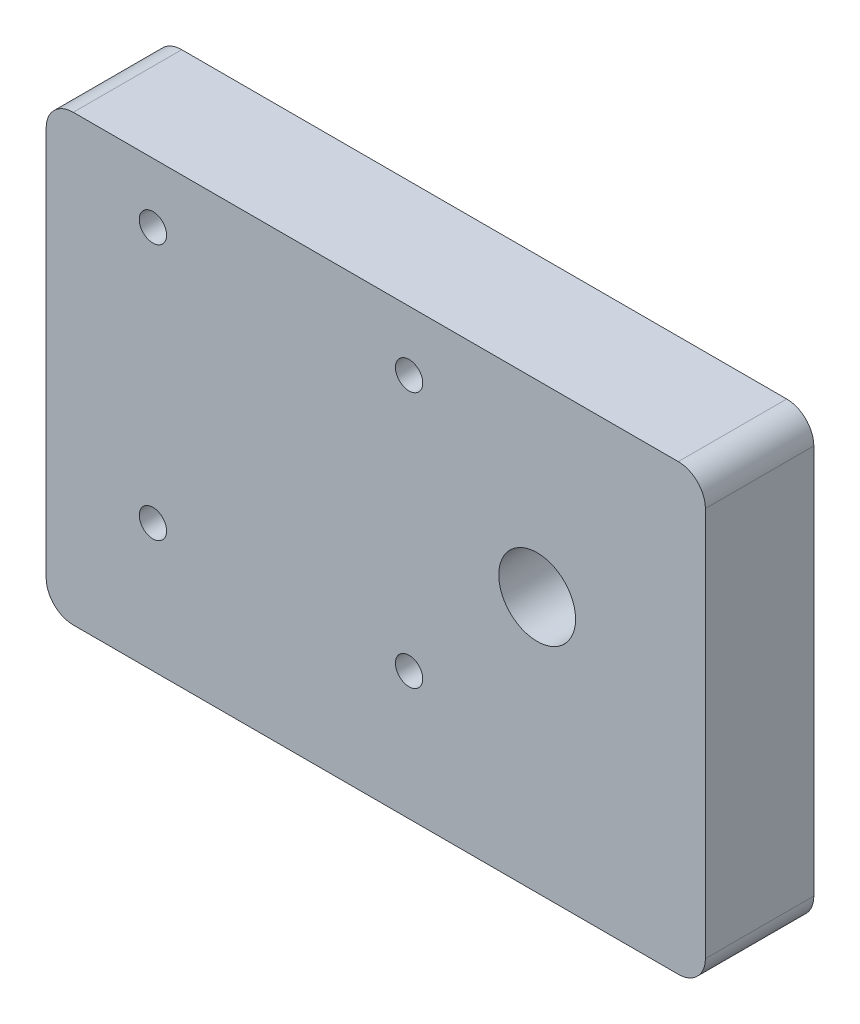
ISO-10303-21;
HEADER;
FILE_DESCRIPTION(('STEP AP214'),'2;1');
FILE_NAME('part.step','',(''),(''),'','','');
FILE_SCHEMA(('AUTOMOTIVE_DESIGN { 1 0 10303 214 1 1 1 1 }'));
ENDSEC;
DATA;
#1=APPLICATION_CONTEXT('core data for automotive mechanical design processes');
#2=APPLICATION_PROTOCOL_DEFINITION('international standard','automotive_design',2000,#1);
#3=PRODUCT_CONTEXT('',#1,'mechanical');
#4=PRODUCT('Part','Part','',(#3));
#5=PRODUCT_RELATED_PRODUCT_CATEGORY('part','',(#4));
#6=PRODUCT_DEFINITION_FORMATION('','',#4);
#7=PRODUCT_DEFINITION_CONTEXT('part definition',#1,'design');
#8=PRODUCT_DEFINITION('design','',#6,#7);
#9=PRODUCT_DEFINITION_SHAPE('','',#8);
#10=(LENGTH_UNIT() NAMED_UNIT(*) SI_UNIT(.MILLI.,.METRE.));
#11=(NAMED_UNIT(*) PLANE_ANGLE_UNIT() SI_UNIT($,.RADIAN.));
#12=(NAMED_UNIT(*) SI_UNIT($,.STERADIAN.) SOLID_ANGLE_UNIT());
#13=UNCERTAINTY_MEASURE_WITH_UNIT(LENGTH_MEASURE(1.E-05),#10,'distance_accuracy_value','');
#14=(GEOMETRIC_REPRESENTATION_CONTEXT(3) GLOBAL_UNCERTAINTY_ASSIGNED_CONTEXT((#13)) GLOBAL_UNIT_ASSIGNED_CONTEXT((#10,
#11,#12)) REPRESENTATION_CONTEXT('',''));
#15=CARTESIAN_POINT('',(0.,0.,0.));
#16=DIRECTION('',(0.,0.,1.));
#17=DIRECTION('',(1.,0.,0.));
#18=AXIS2_PLACEMENT_3D('',#15,#16,#17);
#19=CARTESIAN_POINT('',(72.2,0.,12.7));
#20=DIRECTION('',(1.,0.,0.));
#21=DIRECTION('',(0.,1.,0.));
#22=AXIS2_PLACEMENT_3D('',#19,#20,#21);
#23=PLANE('',#22);
#24=DIRECTION('',(0.,-1.,0.));
#25=VECTOR('',#24,1.);
#26=CARTESIAN_POINT('',(72.2,0.,0.));
#27=LINE('',#26,#25);
#28=CARTESIAN_POINT('',(72.2,-3.175,0.));
#29=VERTEX_POINT('',#28);
#30=CARTESIAN_POINT('',(72.2,-48.825,0.));
#31=VERTEX_POINT('',#30);
#32=EDGE_CURVE('E162',#29,#31,#27,.T.);
#33=ORIENTED_EDGE('',*,*,#32,.F.);
#34=DIRECTION('',(0.,0.,-1.));
#35=VECTOR('',#34,1.);
#36=CARTESIAN_POINT('',(72.2,-3.175,12.7));
#37=LINE('',#36,#35);
#38=CARTESIAN_POINT('',(72.2,-3.175,12.7));
#39=VERTEX_POINT('',#38);
#40=EDGE_CURVE('E178',#29,#39,#37,.F.);
#41=ORIENTED_EDGE('',*,*,#40,.T.);
#42=DIRECTION('',(0.,-1.,0.));
#43=VECTOR('',#42,1.);
#44=CARTESIAN_POINT('',(72.2,0.,12.7));
#45=LINE('',#44,#43);
#46=CARTESIAN_POINT('',(72.2,-48.825,12.7));
#47=VERTEX_POINT('',#46);
#48=EDGE_CURVE('E161',#39,#47,#45,.T.);
#49=ORIENTED_EDGE('',*,*,#48,.T.);
#50=DIRECTION('',(0.,0.,1.));
#51=VECTOR('',#50,1.);
#52=CARTESIAN_POINT('',(72.2,-48.825,0.));
#53=LINE('',#52,#51);
#54=EDGE_CURVE('E176',#47,#31,#53,.F.);
#55=ORIENTED_EDGE('',*,*,#54,.T.);
#56=EDGE_LOOP('',(#33,#41,#49,#55));
#57=FACE_BOUND('',#56,.T.);
#58=ADVANCED_FACE('F73',(#57),#23,.T.);
#59=CARTESIAN_POINT('',(0.,0.,12.7));
#60=DIRECTION('',(0.,1.,0.));
#61=DIRECTION('',(0.,0.,1.));
#62=AXIS2_PLACEMENT_3D('',#59,#60,#61);
#63=PLANE('',#62);
#64=DIRECTION('',(1.,0.,0.));
#65=VECTOR('',#64,1.);
#66=CARTESIAN_POINT('',(0.,0.,12.7));
#67=LINE('',#66,#65);
#68=CARTESIAN_POINT('',(-1.825,0.,12.7));
#69=VERTEX_POINT('',#68);
#70=CARTESIAN_POINT('',(69.025,0.,12.7));
#71=VERTEX_POINT('',#70);
#72=EDGE_CURVE('E166',#69,#71,#67,.T.);
#73=ORIENTED_EDGE('',*,*,#72,.T.);
#74=DIRECTION('',(0.,0.,-1.));
#75=VECTOR('',#74,1.);
#76=CARTESIAN_POINT('',(69.025,0.,12.7));
#77=LINE('',#76,#75);
#78=CARTESIAN_POINT('',(69.025,0.,0.));
#79=VERTEX_POINT('',#78);
#80=EDGE_CURVE('E160',#71,#79,#77,.T.);
#81=ORIENTED_EDGE('',*,*,#80,.T.);
#82=DIRECTION('',(1.,0.,0.));
#83=VECTOR('',#82,1.);
#84=CARTESIAN_POINT('',(0.,0.,0.));
#85=LINE('',#84,#83);
#86=CARTESIAN_POINT('',(-1.825,0.,0.));
#87=VERTEX_POINT('',#86);
#88=EDGE_CURVE('E143',#87,#79,#85,.T.);
#89=ORIENTED_EDGE('',*,*,#88,.F.);
#90=DIRECTION('',(0.,0.,1.));
#91=VECTOR('',#90,1.);
#92=CARTESIAN_POINT('',(-1.825,0.,12.7));
#93=LINE('',#92,#91);
#94=EDGE_CURVE('E157',#87,#69,#93,.T.);
#95=ORIENTED_EDGE('',*,*,#94,.T.);
#96=EDGE_LOOP('',(#73,#81,#89,#95));
#97=FACE_BOUND('',#96,.T.);
#98=ADVANCED_FACE('F156',(#97),#63,.T.);
#99=CARTESIAN_POINT('',(0.,0.,0.));
#100=DIRECTION('',(0.,0.,1.));
#101=DIRECTION('',(1.,0.,0.));
#102=AXIS2_PLACEMENT_3D('',#99,#100,#101);
#103=PLANE('',#102);
#104=CARTESIAN_POINT('',(52.5,-22.,0.));
#105=DIRECTION('',(0.,0.,1.));
#106=DIRECTION('',(1.,0.,0.));
#107=AXIS2_PLACEMENT_3D('',#104,#105,#106);
#108=CIRCLE('',#107,4.5);
#109=CARTESIAN_POINT('',(57.,-22.,0.));
#110=VERTEX_POINT('',#109);
#111=EDGE_CURVE('E204',#110,#110,#108,.T.);
#112=ORIENTED_EDGE('',*,*,#111,.T.);
#113=EDGE_LOOP('',(#112));
#114=FACE_BOUND('',#113,.T.);
#115=CARTESIAN_POINT('',(7.5,-37.,0.));
#116=DIRECTION('',(0.,0.,1.));
#117=DIRECTION('',(1.,0.,0.));
#118=AXIS2_PLACEMENT_3D('',#115,#116,#117);
#119=CIRCLE('',#118,1.6);
#120=CARTESIAN_POINT('',(9.1,-37.,0.));
#121=VERTEX_POINT('',#120);
#122=EDGE_CURVE('E275',#121,#121,#119,.T.);
#123=ORIENTED_EDGE('',*,*,#122,.T.);
#124=EDGE_LOOP('',(#123));
#125=FACE_BOUND('',#124,.T.);
#126=CARTESIAN_POINT('',(7.5,-7.,0.));
#127=DIRECTION('',(0.,0.,1.));
#128=DIRECTION('',(1.,0.,0.));
#129=AXIS2_PLACEMENT_3D('',#126,#127,#128);
#130=CIRCLE('',#129,1.6);
#131=CARTESIAN_POINT('',(9.1,-7.,0.));
#132=VERTEX_POINT('',#131);
#133=EDGE_CURVE('E281',#132,#132,#130,.T.);
#134=ORIENTED_EDGE('',*,*,#133,.T.);
#135=EDGE_LOOP('',(#134));
#136=FACE_BOUND('',#135,.T.);
#137=CARTESIAN_POINT('',(37.5,-7.,0.));
#138=DIRECTION('',(0.,0.,1.));
#139=DIRECTION('',(1.,0.,0.));
#140=AXIS2_PLACEMENT_3D('',#137,#138,#139);
#141=CIRCLE('',#140,1.6);
#142=CARTESIAN_POINT('',(39.1,-7.,0.));
#143=VERTEX_POINT('',#142);
#144=EDGE_CURVE('E290',#143,#143,#141,.T.);
#145=ORIENTED_EDGE('',*,*,#144,.T.);
#146=EDGE_LOOP('',(#145));
#147=FACE_BOUND('',#146,.T.);
#148=CARTESIAN_POINT('',(37.5,-37.,0.));
#149=DIRECTION('',(0.,0.,1.));
#150=DIRECTION('',(1.,0.,0.));
#151=AXIS2_PLACEMENT_3D('',#148,#149,#150);
#152=CIRCLE('',#151,1.60000000000001);
#153=CARTESIAN_POINT('',(39.1,-37.,0.));
#154=VERTEX_POINT('',#153);
#155=EDGE_CURVE('E295',#154,#154,#152,.T.);
#156=ORIENTED_EDGE('',*,*,#155,.T.);
#157=EDGE_LOOP('',(#156));
#158=FACE_BOUND('',#157,.T.);
#159=ORIENTED_EDGE('',*,*,#88,.T.);
#160=CARTESIAN_POINT('',(69.025,-3.175,0.));
#161=DIRECTION('',(0.,0.,1.));
#162=DIRECTION('',(1.,0.,0.));
#163=AXIS2_PLACEMENT_3D('',#160,#161,#162);
#164=CIRCLE('',#163,3.175);
#165=EDGE_CURVE('E174',#79,#29,#164,.F.);
#166=ORIENTED_EDGE('',*,*,#165,.T.);
#167=ORIENTED_EDGE('',*,*,#32,.T.);
#168=CARTESIAN_POINT('',(69.025,-48.825,0.));
#169=DIRECTION('',(0.,0.,1.));
#170=DIRECTION('',(1.,0.,0.));
#171=AXIS2_PLACEMENT_3D('',#168,#169,#170);
#172=CIRCLE('',#171,3.175);
#173=CARTESIAN_POINT('',(69.025,-52.,0.));
#174=VERTEX_POINT('',#173);
#175=EDGE_CURVE('E149',#31,#174,#172,.F.);
#176=ORIENTED_EDGE('',*,*,#175,.T.);
#177=DIRECTION('',(1.,0.,0.));
#178=VECTOR('',#177,1.);
#179=CARTESIAN_POINT('',(0.,-52.,0.));
#180=LINE('',#179,#178);
#181=CARTESIAN_POINT('',(-1.825,-52.,0.));
#182=VERTEX_POINT('',#181);
#183=EDGE_CURVE('E201',#182,#174,#180,.T.);
#184=ORIENTED_EDGE('',*,*,#183,.F.);
#185=CARTESIAN_POINT('',(-1.825,-48.825,0.));
#186=DIRECTION('',(0.,0.,1.));
#187=DIRECTION('',(1.,0.,0.));
#188=AXIS2_PLACEMENT_3D('',#185,#186,#187);
#189=CIRCLE('',#188,3.175);
#190=CARTESIAN_POINT('',(-4.99999999999999,-48.825,0.));
#191=VERTEX_POINT('',#190);
#192=EDGE_CURVE('E150',#182,#191,#189,.F.);
#193=ORIENTED_EDGE('',*,*,#192,.T.);
#194=DIRECTION('',(0.,1.,0.));
#195=VECTOR('',#194,1.);
#196=CARTESIAN_POINT('',(-5.,0.,0.));
#197=LINE('',#196,#195);
#198=CARTESIAN_POINT('',(-5.,-3.175,0.));
#199=VERTEX_POINT('',#198);
#200=EDGE_CURVE('E145',#191,#199,#197,.T.);
#201=ORIENTED_EDGE('',*,*,#200,.T.);
#202=CARTESIAN_POINT('',(-1.825,-3.175,0.));
#203=DIRECTION('',(0.,0.,1.));
#204=DIRECTION('',(1.,0.,0.));
#205=AXIS2_PLACEMENT_3D('',#202,#203,#204);
#206=CIRCLE('',#205,3.175);
#207=EDGE_CURVE('E140',#199,#87,#206,.F.);
#208=ORIENTED_EDGE('',*,*,#207,.T.);
#209=EDGE_LOOP('',(#159,#166,#167,#176,#184,#193,#201,#208));
#210=FACE_BOUND('',#209,.T.);
#211=ADVANCED_FACE('F142',(#114,#125,#136,#147,#158,#210),#103,.F.);
#212=CARTESIAN_POINT('',(0.,0.,12.7));
#213=DIRECTION('',(0.,0.,1.));
#214=DIRECTION('',(1.,0.,0.));
#215=AXIS2_PLACEMENT_3D('',#212,#213,#214);
#216=PLANE('',#215);
#217=CARTESIAN_POINT('',(52.5,-22.,12.7));
#218=DIRECTION('',(0.,0.,1.));
#219=DIRECTION('',(1.,0.,0.));
#220=AXIS2_PLACEMENT_3D('',#217,#218,#219);
#221=CIRCLE('',#220,4.5);
#222=CARTESIAN_POINT('',(57.,-22.,12.7));
#223=VERTEX_POINT('',#222);
#224=EDGE_CURVE('E199',#223,#223,#221,.T.);
#225=ORIENTED_EDGE('',*,*,#224,.F.);
#226=EDGE_LOOP('',(#225));
#227=FACE_BOUND('',#226,.T.);
#228=CARTESIAN_POINT('',(7.5,-37.,12.7));
#229=DIRECTION('',(0.,0.,1.));
#230=DIRECTION('',(1.,0.,0.));
#231=AXIS2_PLACEMENT_3D('',#228,#229,#230);
#232=CIRCLE('',#231,1.6);
#233=CARTESIAN_POINT('',(9.1,-37.,12.7));
#234=VERTEX_POINT('',#233);
#235=EDGE_CURVE('E272',#234,#234,#232,.T.);
#236=ORIENTED_EDGE('',*,*,#235,.F.);
#237=EDGE_LOOP('',(#236));
#238=FACE_BOUND('',#237,.T.);
#239=CARTESIAN_POINT('',(7.5,-7.,12.7));
#240=DIRECTION('',(0.,0.,1.));
#241=DIRECTION('',(1.,0.,0.));
#242=AXIS2_PLACEMENT_3D('',#239,#240,#241);
#243=CIRCLE('',#242,1.6);
#244=CARTESIAN_POINT('',(9.1,-7.,12.7));
#245=VERTEX_POINT('',#244);
#246=EDGE_CURVE('E277',#245,#245,#243,.T.);
#247=ORIENTED_EDGE('',*,*,#246,.F.);
#248=EDGE_LOOP('',(#247));
#249=FACE_BOUND('',#248,.T.);
#250=CARTESIAN_POINT('',(37.5,-7.,12.7));
#251=DIRECTION('',(0.,0.,1.));
#252=DIRECTION('',(1.,0.,0.));
#253=AXIS2_PLACEMENT_3D('',#250,#251,#252);
#254=CIRCLE('',#253,1.6);
#255=CARTESIAN_POINT('',(39.1,-7.,12.7));
#256=VERTEX_POINT('',#255);
#257=EDGE_CURVE('E287',#256,#256,#254,.T.);
#258=ORIENTED_EDGE('',*,*,#257,.F.);
#259=EDGE_LOOP('',(#258));
#260=FACE_BOUND('',#259,.T.);
#261=CARTESIAN_POINT('',(37.5,-37.,12.7));
#262=DIRECTION('',(0.,0.,1.));
#263=DIRECTION('',(1.,0.,0.));
#264=AXIS2_PLACEMENT_3D('',#261,#262,#263);
#265=CIRCLE('',#264,1.60000000000001);
#266=CARTESIAN_POINT('',(39.1,-37.,12.7));
#267=VERTEX_POINT('',#266);
#268=EDGE_CURVE('E293',#267,#267,#265,.T.);
#269=ORIENTED_EDGE('',*,*,#268,.F.);
#270=EDGE_LOOP('',(#269));
#271=FACE_BOUND('',#270,.T.);
#272=ORIENTED_EDGE('',*,*,#48,.F.);
#273=CARTESIAN_POINT('',(69.025,-3.175,12.7));
#274=DIRECTION('',(0.,0.,1.));
#275=DIRECTION('',(1.,0.,0.));
#276=AXIS2_PLACEMENT_3D('',#273,#274,#275);
#277=CIRCLE('',#276,3.175);
#278=EDGE_CURVE('E183',#39,#71,#277,.T.);
#279=ORIENTED_EDGE('',*,*,#278,.T.);
#280=ORIENTED_EDGE('',*,*,#72,.F.);
#281=CARTESIAN_POINT('',(-1.825,-3.175,12.7));
#282=DIRECTION('',(0.,0.,1.));
#283=DIRECTION('',(1.,0.,0.));
#284=AXIS2_PLACEMENT_3D('',#281,#282,#283);
#285=CIRCLE('',#284,3.175);
#286=CARTESIAN_POINT('',(-5.,-3.175,12.7));
#287=VERTEX_POINT('',#286);
#288=EDGE_CURVE('E165',#69,#287,#285,.T.);
#289=ORIENTED_EDGE('',*,*,#288,.T.);
#290=DIRECTION('',(0.,-1.,0.));
#291=VECTOR('',#290,1.);
#292=CARTESIAN_POINT('',(-5.,0.,12.7));
#293=LINE('',#292,#291);
#294=CARTESIAN_POINT('',(-4.99999999999999,-48.825,12.7));
#295=VERTEX_POINT('',#294);
#296=EDGE_CURVE('E193',#287,#295,#293,.T.);
#297=ORIENTED_EDGE('',*,*,#296,.T.);
#298=CARTESIAN_POINT('',(-1.825,-48.825,12.7));
#299=DIRECTION('',(0.,0.,1.));
#300=DIRECTION('',(1.,0.,0.));
#301=AXIS2_PLACEMENT_3D('',#298,#299,#300);
#302=CIRCLE('',#301,3.175);
#303=CARTESIAN_POINT('',(-1.825,-52.,12.7));
#304=VERTEX_POINT('',#303);
#305=EDGE_CURVE('E88',#295,#304,#302,.T.);
#306=ORIENTED_EDGE('',*,*,#305,.T.);
#307=DIRECTION('',(-1.,0.,0.));
#308=VECTOR('',#307,1.);
#309=CARTESIAN_POINT('',(0.,-52.,12.7));
#310=LINE('',#309,#308);
#311=CARTESIAN_POINT('',(69.025,-52.,12.7));
#312=VERTEX_POINT('',#311);
#313=EDGE_CURVE('E198',#312,#304,#310,.T.);
#314=ORIENTED_EDGE('',*,*,#313,.F.);
#315=CARTESIAN_POINT('',(69.025,-48.825,12.7));
#316=DIRECTION('',(0.,0.,1.));
#317=DIRECTION('',(1.,0.,0.));
#318=AXIS2_PLACEMENT_3D('',#315,#316,#317);
#319=CIRCLE('',#318,3.175);
#320=EDGE_CURVE('E96',#312,#47,#319,.T.);
#321=ORIENTED_EDGE('',*,*,#320,.T.);
#322=EDGE_LOOP('',(#272,#279,#280,#289,#297,#306,#314,#321));
#323=FACE_BOUND('',#322,.T.);
#324=ADVANCED_FACE('F197',(#227,#238,#249,#260,#271,#323),#216,.T.);
#325=CARTESIAN_POINT('',(0.,-52.,-93.0797507517076));
#326=DIRECTION('',(0.,1.,0.));
#327=DIRECTION('',(0.,0.,1.));
#328=AXIS2_PLACEMENT_3D('',#325,#326,#327);
#329=PLANE('',#328);
#330=ORIENTED_EDGE('',*,*,#183,.T.);
#331=DIRECTION('',(0.,0.,1.));
#332=VECTOR('',#331,1.);
#333=CARTESIAN_POINT('',(69.025,-52.,12.7));
#334=LINE('',#333,#332);
#335=EDGE_CURVE('E187',#174,#312,#334,.T.);
#336=ORIENTED_EDGE('',*,*,#335,.T.);
#337=ORIENTED_EDGE('',*,*,#313,.T.);
#338=DIRECTION('',(0.,0.,1.));
#339=VECTOR('',#338,1.);
#340=CARTESIAN_POINT('',(-1.825,-52.,0.));
#341=LINE('',#340,#339);
#342=EDGE_CURVE('E185',#304,#182,#341,.F.);
#343=ORIENTED_EDGE('',*,*,#342,.T.);
#344=EDGE_LOOP('',(#330,#336,#337,#343));
#345=FACE_BOUND('',#344,.T.);
#346=ADVANCED_FACE('F220',(#345),#329,.F.);
#347=CARTESIAN_POINT('',(-5.,0.,-93.0797507517076));
#348=DIRECTION('',(-1.,0.,0.));
#349=DIRECTION('',(0.,-1.,0.));
#350=AXIS2_PLACEMENT_3D('',#347,#348,#349);
#351=PLANE('',#350);
#352=ORIENTED_EDGE('',*,*,#296,.F.);
#353=DIRECTION('',(0.,0.,1.));
#354=VECTOR('',#353,1.);
#355=CARTESIAN_POINT('',(-5.,-3.175,-93.0797507517076));
#356=LINE('',#355,#354);
#357=EDGE_CURVE('E12',#287,#199,#356,.F.);
#358=ORIENTED_EDGE('',*,*,#357,.T.);
#359=ORIENTED_EDGE('',*,*,#200,.F.);
#360=DIRECTION('',(0.,0.,1.));
#361=VECTOR('',#360,1.);
#362=CARTESIAN_POINT('',(-4.99999999999999,-48.825,12.7));
#363=LINE('',#362,#361);
#364=EDGE_CURVE('E81',#191,#295,#363,.T.);
#365=ORIENTED_EDGE('',*,*,#364,.T.);
#366=EDGE_LOOP('',(#352,#358,#359,#365));
#367=FACE_BOUND('',#366,.T.);
#368=ADVANCED_FACE('F192',(#367),#351,.T.);
#369=CARTESIAN_POINT('',(37.5,-37.,12.7));
#370=DIRECTION('',(0.,0.,-1.));
#371=DIRECTION('',(-1.,0.,0.));
#372=AXIS2_PLACEMENT_3D('',#369,#370,#371);
#373=CYLINDRICAL_SURFACE('',#372,1.60000000000001);
#374=ORIENTED_EDGE('',*,*,#268,.T.);
#375=EDGE_LOOP('',(#374));
#376=FACE_BOUND('',#375,.T.);
#377=ORIENTED_EDGE('',*,*,#155,.F.);
#378=EDGE_LOOP('',(#377));
#379=FACE_BOUND('',#378,.T.);
#380=ADVANCED_FACE('F251',(#376,#379),#373,.F.);
#381=CARTESIAN_POINT('',(37.5,-7.,12.7));
#382=DIRECTION('',(0.,0.,-1.));
#383=DIRECTION('',(-1.,0.,0.));
#384=AXIS2_PLACEMENT_3D('',#381,#382,#383);
#385=CYLINDRICAL_SURFACE('',#384,1.6);
#386=ORIENTED_EDGE('',*,*,#257,.T.);
#387=EDGE_LOOP('',(#386));
#388=FACE_BOUND('',#387,.T.);
#389=ORIENTED_EDGE('',*,*,#144,.F.);
#390=EDGE_LOOP('',(#389));
#391=FACE_BOUND('',#390,.T.);
#392=ADVANCED_FACE('F256',(#388,#391),#385,.F.);
#393=CARTESIAN_POINT('',(7.5,-7.,12.7));
#394=DIRECTION('',(0.,0.,-1.));
#395=DIRECTION('',(-1.,0.,0.));
#396=AXIS2_PLACEMENT_3D('',#393,#394,#395);
#397=CYLINDRICAL_SURFACE('',#396,1.6);
#398=ORIENTED_EDGE('',*,*,#246,.T.);
#399=EDGE_LOOP('',(#398));
#400=FACE_BOUND('',#399,.T.);
#401=ORIENTED_EDGE('',*,*,#133,.F.);
#402=EDGE_LOOP('',(#401));
#403=FACE_BOUND('',#402,.T.);
#404=ADVANCED_FACE('F260',(#400,#403),#397,.F.);
#405=CARTESIAN_POINT('',(7.5,-37.,12.7));
#406=DIRECTION('',(0.,0.,-1.));
#407=DIRECTION('',(-1.,0.,0.));
#408=AXIS2_PLACEMENT_3D('',#405,#406,#407);
#409=CYLINDRICAL_SURFACE('',#408,1.6);
#410=ORIENTED_EDGE('',*,*,#235,.T.);
#411=EDGE_LOOP('',(#410));
#412=FACE_BOUND('',#411,.T.);
#413=ORIENTED_EDGE('',*,*,#122,.F.);
#414=EDGE_LOOP('',(#413));
#415=FACE_BOUND('',#414,.T.);
#416=ADVANCED_FACE('F233',(#412,#415),#409,.F.);
#417=CARTESIAN_POINT('',(52.5,-22.,12.7));
#418=DIRECTION('',(0.,0.,-1.));
#419=DIRECTION('',(-1.,0.,0.));
#420=AXIS2_PLACEMENT_3D('',#417,#418,#419);
#421=CYLINDRICAL_SURFACE('',#420,4.5);
#422=ORIENTED_EDGE('',*,*,#224,.T.);
#423=EDGE_LOOP('',(#422));
#424=FACE_BOUND('',#423,.T.);
#425=ORIENTED_EDGE('',*,*,#111,.F.);
#426=EDGE_LOOP('',(#425));
#427=FACE_BOUND('',#426,.T.);
#428=ADVANCED_FACE('F226',(#424,#427),#421,.F.);
#429=CARTESIAN_POINT('',(69.025,-3.175,12.7));
#430=DIRECTION('',(0.,0.,-1.));
#431=DIRECTION('',(-1.,0.,0.));
#432=AXIS2_PLACEMENT_3D('',#429,#430,#431);
#433=CYLINDRICAL_SURFACE('',#432,3.175);
#434=ORIENTED_EDGE('',*,*,#278,.F.);
#435=ORIENTED_EDGE('',*,*,#40,.F.);
#436=ORIENTED_EDGE('',*,*,#165,.F.);
#437=ORIENTED_EDGE('',*,*,#80,.F.);
#438=EDGE_LOOP('',(#434,#435,#436,#437));
#439=FACE_BOUND('',#438,.T.);
#440=ADVANCED_FACE('F224',(#439),#433,.T.);
#441=CARTESIAN_POINT('',(69.025,-48.825,-93.0797507517076));
#442=DIRECTION('',(0.,0.,-1.));
#443=DIRECTION('',(-1.,0.,0.));
#444=AXIS2_PLACEMENT_3D('',#441,#442,#443);
#445=CYLINDRICAL_SURFACE('',#444,3.175);
#446=ORIENTED_EDGE('',*,*,#175,.F.);
#447=ORIENTED_EDGE('',*,*,#54,.F.);
#448=ORIENTED_EDGE('',*,*,#320,.F.);
#449=ORIENTED_EDGE('',*,*,#335,.F.);
#450=EDGE_LOOP('',(#446,#447,#448,#449));
#451=FACE_BOUND('',#450,.T.);
#452=ADVANCED_FACE('F218',(#451),#445,.T.);
#453=CARTESIAN_POINT('',(-1.825,-3.175,12.7));
#454=DIRECTION('',(0.,0.,1.));
#455=DIRECTION('',(1.,0.,0.));
#456=AXIS2_PLACEMENT_3D('',#453,#454,#455);
#457=CYLINDRICAL_SURFACE('',#456,3.175);
#458=ORIENTED_EDGE('',*,*,#207,.F.);
#459=ORIENTED_EDGE('',*,*,#357,.F.);
#460=ORIENTED_EDGE('',*,*,#288,.F.);
#461=ORIENTED_EDGE('',*,*,#94,.F.);
#462=EDGE_LOOP('',(#458,#459,#460,#461));
#463=FACE_BOUND('',#462,.T.);
#464=ADVANCED_FACE('F164',(#463),#457,.T.);
#465=CARTESIAN_POINT('',(-1.825,-48.825,-93.0797507517076));
#466=DIRECTION('',(0.,0.,-1.));
#467=DIRECTION('',(-1.,0.,0.));
#468=AXIS2_PLACEMENT_3D('',#465,#466,#467);
#469=CYLINDRICAL_SURFACE('',#468,3.175);
#470=ORIENTED_EDGE('',*,*,#192,.F.);
#471=ORIENTED_EDGE('',*,*,#342,.F.);
#472=ORIENTED_EDGE('',*,*,#305,.F.);
#473=ORIENTED_EDGE('',*,*,#364,.F.);
#474=EDGE_LOOP('',(#470,#471,#472,#473));
#475=FACE_BOUND('',#474,.T.);
#476=ADVANCED_FACE('F75',(#475),#469,.T.);
#477=CLOSED_SHELL('',(#58,#98,#211,#324,#346,#368,#380,#392,#404,#416,#428,#440,#452,#464,#476));
#478=MANIFOLD_SOLID_BREP('B2',#477);
#479=ADVANCED_BREP_SHAPE_REPRESENTATION('',(#18,#478),#14);
#480=SHAPE_DEFINITION_REPRESENTATION(#9,#479);
ENDSEC;
END-ISO-10303-21;
